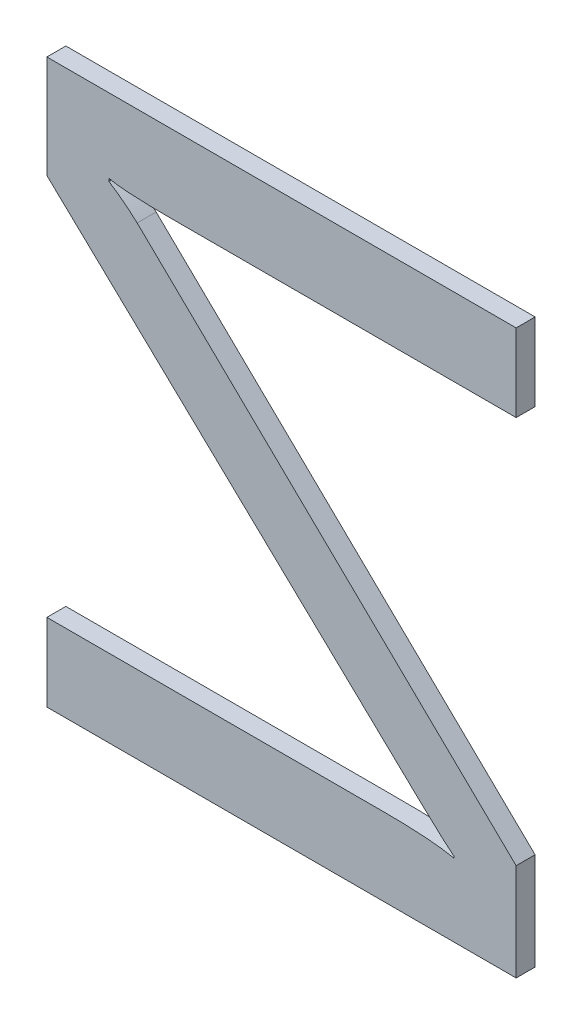
ISO-10303-21;
HEADER;
FILE_DESCRIPTION(('STEP AP214'),'2;1');
FILE_NAME('part.step','',(''),(''),'','','');
FILE_SCHEMA(('AUTOMOTIVE_DESIGN { 1 0 10303 214 1 1 1 1 }'));
ENDSEC;
DATA;
#1=APPLICATION_CONTEXT('core data for automotive mechanical design processes');
#2=APPLICATION_PROTOCOL_DEFINITION('international standard','automotive_design',2000,#1);
#3=PRODUCT_CONTEXT('',#1,'mechanical');
#4=PRODUCT('Part','Part','',(#3));
#5=PRODUCT_RELATED_PRODUCT_CATEGORY('part','',(#4));
#6=PRODUCT_DEFINITION_FORMATION('','',#4);
#7=PRODUCT_DEFINITION_CONTEXT('part definition',#1,'design');
#8=PRODUCT_DEFINITION('design','',#6,#7);
#9=PRODUCT_DEFINITION_SHAPE('','',#8);
#10=(LENGTH_UNIT() NAMED_UNIT(*) SI_UNIT(.MILLI.,.METRE.));
#11=(NAMED_UNIT(*) PLANE_ANGLE_UNIT() SI_UNIT($,.RADIAN.));
#12=(NAMED_UNIT(*) SI_UNIT($,.STERADIAN.) SOLID_ANGLE_UNIT());
#13=UNCERTAINTY_MEASURE_WITH_UNIT(LENGTH_MEASURE(1.E-05),#10,'distance_accuracy_value','');
#14=(GEOMETRIC_REPRESENTATION_CONTEXT(3) GLOBAL_UNCERTAINTY_ASSIGNED_CONTEXT((#13)) GLOBAL_UNIT_ASSIGNED_CONTEXT((#10,
#11,#12)) REPRESENTATION_CONTEXT('',''));
#15=CARTESIAN_POINT('',(0.,0.,0.));
#16=DIRECTION('',(0.,0.,1.));
#17=DIRECTION('',(1.,0.,0.));
#18=AXIS2_PLACEMENT_3D('',#15,#16,#17);
#19=CARTESIAN_POINT('',(-8.95983005625009,-22.770458436575,135.210489149433));
#20=DIRECTION('',(0.,0.,-1.));
#21=DIRECTION('',(0.,-1.,0.));
#22=AXIS2_PLACEMENT_3D('',#19,#20,#21);
#23=PLANE('',#22);
#24=CARTESIAN_POINT('',(-12.8508212671876,-42.050979159912,135.210489149433));
#25=CARTESIAN_POINT('',(-12.6975760748799,-42.0892903644555,135.210489149433));
#26=CARTESIAN_POINT('',(-12.3655443260348,-42.1084461070274,135.210489149433));
#27=CARTESIAN_POINT('',(-10.0413260748799,-42.1084461070274,135.210489149433));
#28=CARTESIAN_POINT('',(-8.22792463257218,-42.1084461070274,135.210489149433));
#29=CARTESIAN_POINT('',(-6.41452319026449,-42.1084461070274,135.210489149433));
#30=(BOUNDED_CURVE() B_SPLINE_CURVE(3,(#24,#25,#26,#27,#28,#29),.UNSPECIFIED.,.F.,
.F.) B_SPLINE_CURVE_WITH_KNOTS((4,2,4),(0.,0.219780052322297,1.),
.UNSPECIFIED.) CURVE() GEOMETRIC_REPRESENTATION_ITEM() RATIONAL_B_SPLINE_CURVE((1.,1.,1.,1.,1.,1.)) REPRESENTATION_ITEM(''));
#31=CARTESIAN_POINT('',(-12.8508212671876,-42.050979159912,135.210489149433));
#32=VERTEX_POINT('',#31);
#33=CARTESIAN_POINT('',(-6.41452319026449,-42.1084461070274,135.210489149433));
#34=VERTEX_POINT('',#33);
#35=EDGE_CURVE('E318',#32,#34,#30,.T.);
#36=ORIENTED_EDGE('',*,*,#35,.T.);
#37=DIRECTION('',(0.,1.,0.));
#38=VECTOR('',#37,1.);
#39=CARTESIAN_POINT('',(-6.41452319026449,5.40908312699247,135.210489149433));
#40=LINE('',#39,#38);
#41=CARTESIAN_POINT('',(-6.41452319026449,-40.8800901124361,135.210489149433));
#42=VERTEX_POINT('',#41);
#43=EDGE_CURVE('E62',#34,#42,#40,.T.);
#44=ORIENTED_EDGE('',*,*,#43,.T.);
#45=DIRECTION('',(-1.,0.,0.));
#46=VECTOR('',#45,1.);
#47=CARTESIAN_POINT('',(2.66453525910038E-13,-40.8800901124361,135.210489149433));
#48=LINE('',#47,#46);
#49=CARTESIAN_POINT('',(-13.8325482804087,-40.8800901124361,135.210489149433));
#50=VERTEX_POINT('',#49);
#51=EDGE_CURVE('E173',#42,#50,#48,.T.);
#52=ORIENTED_EDGE('',*,*,#51,.T.);
#53=DIRECTION('',(0.,-1.,0.));
#54=VECTOR('',#53,1.);
#55=CARTESIAN_POINT('',(-13.8325482804087,5.40908312699247,135.210489149433));
#56=LINE('',#55,#54);
#57=CARTESIAN_POINT('',(-13.8325482804087,-42.5035313684456,135.210489149433));
#58=VERTEX_POINT('',#57);
#59=EDGE_CURVE('E159',#50,#58,#56,.T.);
#60=ORIENTED_EDGE('',*,*,#59,.T.);
#61=DIRECTION('',(0.724151841395312,-0.689640566239965,0.));
#62=VECTOR('',#61,1.);
#63=CARTESIAN_POINT('',(-30.5065914345945,-26.6241316279084,135.210489149433));
#64=LINE('',#63,#62);
#65=CARTESIAN_POINT('',(-7.90387490300488,-48.1496589225322,135.210489149433));
#66=VERTEX_POINT('',#65);
#67=EDGE_CURVE('E237',#58,#66,#64,.T.);
#68=ORIENTED_EDGE('',*,*,#67,.T.);
#69=CARTESIAN_POINT('',(-7.90387490300488,-48.1496589225322,135.210489149433));
#70=CARTESIAN_POINT('',(-7.59738451838949,-48.4369936581091,135.210489149433));
#71=CARTESIAN_POINT('',(-7.42817653463893,-48.587844394287,135.210489149433));
#72=CARTESIAN_POINT('',(-7.39625020348565,-48.6022111310659,135.210489149433));
#73=(BOUNDED_CURVE() B_SPLINE_CURVE(3,(#69,#70,#71,#72),.UNSPECIFIED.,.F.,
.F.) B_SPLINE_CURVE_WITH_KNOTS((4,4),(0.,1.),
.UNSPECIFIED.) CURVE() GEOMETRIC_REPRESENTATION_ITEM() RATIONAL_B_SPLINE_CURVE((1.,1.,1.,1.)) REPRESENTATION_ITEM(''));
#74=CARTESIAN_POINT('',(-7.39625020348565,-48.6022111310659,135.210489149433));
#75=VERTEX_POINT('',#74);
#76=EDGE_CURVE('E53',#66,#75,#73,.T.);
#77=ORIENTED_EDGE('',*,*,#76,.T.);
#78=DIRECTION('',(0.,-1.,0.));
#79=VECTOR('',#78,1.);
#80=CARTESIAN_POINT('',(-7.39625020348565,5.40908312699247,135.210489149433));
#81=LINE('',#80,#79);
#82=CARTESIAN_POINT('',(-7.39625020348565,-48.6309446046236,135.210489149433));
#83=VERTEX_POINT('',#82);
#84=EDGE_CURVE('E210',#75,#83,#81,.T.);
#85=ORIENTED_EDGE('',*,*,#84,.T.);
#86=CARTESIAN_POINT('',(-7.39625020348565,-48.6309446046236,135.210489149433));
#87=CARTESIAN_POINT('',(-7.64208078339006,-48.5782663827009,135.210489149433));
#88=CARTESIAN_POINT('',(-8.01401988497603,-48.5519275523399,135.210489149433));
#89=CARTESIAN_POINT('',(-10.2855606001203,-48.5519275523399,135.210489149433));
#90=CARTESIAN_POINT('',(-12.0590544402645,-48.5519275523399,135.210489149433));
#91=CARTESIAN_POINT('',(-13.8325482804087,-48.5519275523399,135.210489149433));
#92=(BOUNDED_CURVE() B_SPLINE_CURVE(3,(#86,#87,#88,#89,#90,#91),.UNSPECIFIED.,.F.,
.F.) B_SPLINE_CURVE_WITH_KNOTS((4,2,4),(0.,0.21925509486999,1.),
.UNSPECIFIED.) CURVE() GEOMETRIC_REPRESENTATION_ITEM() RATIONAL_B_SPLINE_CURVE((1.,1.,1.,1.,1.,1.)) REPRESENTATION_ITEM(''));
#93=CARTESIAN_POINT('',(-13.8325482804087,-48.5519275523399,135.210489149433));
#94=VERTEX_POINT('',#93);
#95=EDGE_CURVE('E220',#83,#94,#92,.T.);
#96=ORIENTED_EDGE('',*,*,#95,.T.);
#97=DIRECTION('',(0.,-1.,0.));
#98=VECTOR('',#97,1.);
#99=CARTESIAN_POINT('',(-13.8325482804087,5.40908312699247,135.210489149433));
#100=LINE('',#99,#98);
#101=CARTESIAN_POINT('',(-13.8325482804087,-49.7802835469312,135.210489149433));
#102=VERTEX_POINT('',#101);
#103=EDGE_CURVE('E219',#94,#102,#100,.T.);
#104=ORIENTED_EDGE('',*,*,#103,.T.);
#105=DIRECTION('',(1.,0.,0.));
#106=VECTOR('',#105,1.);
#107=CARTESIAN_POINT('',(2.66453525910038E-13,-49.7802835469312,135.210489149433));
#108=LINE('',#107,#106);
#109=CARTESIAN_POINT('',(-6.41452319026449,-49.7802835469312,135.210489149433));
#110=VERTEX_POINT('',#109);
#111=EDGE_CURVE('E88',#102,#110,#108,.T.);
#112=ORIENTED_EDGE('',*,*,#111,.T.);
#113=DIRECTION('',(0.,1.,0.));
#114=VECTOR('',#113,1.);
#115=CARTESIAN_POINT('',(-6.41452319026449,5.40908312699247,135.210489149433));
#116=LINE('',#115,#114);
#117=CARTESIAN_POINT('',(-6.41452319026449,-48.2430427115947,135.210489149433));
#118=VERTEX_POINT('',#117);
#119=EDGE_CURVE('E47',#110,#118,#116,.T.);
#120=ORIENTED_EDGE('',*,*,#119,.T.);
#121=DIRECTION('',(-0.718213324339423,0.695822980894792,0.));
#122=VECTOR('',#121,1.);
#123=CARTESIAN_POINT('',(-29.9183315370501,-25.4719669991212,135.210489149433));
#124=LINE('',#123,#122);
#125=CARTESIAN_POINT('',(-12.4054524270433,-42.4388810529409,135.210489149433));
#126=VERTEX_POINT('',#125);
#127=EDGE_CURVE('E182',#118,#126,#124,.T.);
#128=ORIENTED_EDGE('',*,*,#127,.T.);
#129=CARTESIAN_POINT('',(-12.4054524270433,-42.4388810529409,135.210489149433));
#130=CARTESIAN_POINT('',(-12.6161641923327,-42.2449301064264,135.210489149433));
#131=CARTESIAN_POINT('',(-12.8508212671876,-42.0940793702485,135.210489149433));
#132=(BOUNDED_CURVE() B_SPLINE_CURVE(2,(#129,#130,#131),.UNSPECIFIED.,.F.,
.F.) B_SPLINE_CURVE_WITH_KNOTS((3,3),(0.,1.),
.UNSPECIFIED.) CURVE() GEOMETRIC_REPRESENTATION_ITEM() RATIONAL_B_SPLINE_CURVE((1.,1.,1.)) REPRESENTATION_ITEM(''));
#133=CARTESIAN_POINT('',(-12.8508212671876,-42.0940793702485,135.210489149433));
#134=VERTEX_POINT('',#133);
#135=EDGE_CURVE('E11',#126,#134,#132,.T.);
#136=ORIENTED_EDGE('',*,*,#135,.T.);
#137=DIRECTION('',(0.,1.,0.));
#138=VECTOR('',#137,1.);
#139=CARTESIAN_POINT('',(-12.8508212671876,5.40908312699247,135.210489149433));
#140=LINE('',#139,#138);
#141=EDGE_CURVE('E236',#134,#32,#140,.T.);
#142=ORIENTED_EDGE('',*,*,#141,.T.);
#143=EDGE_LOOP('',(#36,#44,#52,#60,#68,#77,#85,#96,#104,#112,#120,#128,#136,#142));
#144=FACE_BOUND('',#143,.T.);
#145=ADVANCED_FACE('F43',(#144),#23,.F.);
#146=CARTESIAN_POINT('',(-12.8508212671876,-42.0940793702485,135.410489149433));
#147=CARTESIAN_POINT('',(-12.6161641923327,-42.2449301064264,135.410489149433));
#148=CARTESIAN_POINT('',(-12.4054524270433,-42.4388810529409,135.410489149433));
#149=(BOUNDED_CURVE() B_SPLINE_CURVE(2,(#146,#147,#148),.UNSPECIFIED.,.F.,
.F.) B_SPLINE_CURVE_WITH_KNOTS((3,3),(0.,1.),
.UNSPECIFIED.) CURVE() GEOMETRIC_REPRESENTATION_ITEM() RATIONAL_B_SPLINE_CURVE((1.,1.,1.)) REPRESENTATION_ITEM(''));
#150=DIRECTION('',(0.,0.,-1.));
#151=VECTOR('',#150,1.);
#152=SURFACE_OF_LINEAR_EXTRUSION('',#149,#151);
#153=ORIENTED_EDGE('',*,*,#135,.F.);
#154=CARTESIAN_POINT('',(-12.4054524270433,-42.4388810529409,135.210489149433));
#155=CARTESIAN_POINT('',(-12.4054524270433,-42.4388810529409,134.910489149433));
#156=(BOUNDED_CURVE() B_SPLINE_CURVE(1,(#154,#155),.UNSPECIFIED.,.F.,
.F.) B_SPLINE_CURVE_WITH_KNOTS((2,2),(0.,1.),
.UNSPECIFIED.) CURVE() GEOMETRIC_REPRESENTATION_ITEM() RATIONAL_B_SPLINE_CURVE((1.,1.)) REPRESENTATION_ITEM(''));
#157=CARTESIAN_POINT('',(-12.4054524270433,-42.4388810529409,134.910489149433));
#158=VERTEX_POINT('',#157);
#159=EDGE_CURVE('E141',#126,#158,#156,.T.);
#160=ORIENTED_EDGE('',*,*,#159,.T.);
#161=CARTESIAN_POINT('',(-12.8508212671876,-42.0940793702486,134.910489149433));
#162=CARTESIAN_POINT('',(-12.6943832172843,-42.1946465277005,134.910489149433));
#163=CARTESIAN_POINT('',(-12.5459269372362,-42.3095804219312,134.910489149433));
#164=CARTESIAN_POINT('',(-12.4054524270433,-42.4388810529409,134.910489149433));
#165=(BOUNDED_CURVE() B_SPLINE_CURVE(3,(#161,#162,#163,#164),.UNSPECIFIED.,.F.,
.F.) B_SPLINE_CURVE_WITH_KNOTS((4,4),(0.,1.),
.UNSPECIFIED.) CURVE() GEOMETRIC_REPRESENTATION_ITEM() RATIONAL_B_SPLINE_CURVE((1.,1.,1.,1.)) REPRESENTATION_ITEM(''));
#166=CARTESIAN_POINT('',(-12.8508211005209,-42.0940792792566,134.910489149433));
#167=VERTEX_POINT('',#166);
#168=EDGE_CURVE('E281',#167,#158,#165,.T.);
#169=ORIENTED_EDGE('',*,*,#168,.F.);
#170=CARTESIAN_POINT('',(-12.8508212671876,-42.0940792792566,135.210489149433));
#171=CARTESIAN_POINT('',(-12.8508212671876,-42.0940792792566,135.110489149433));
#172=CARTESIAN_POINT('',(-12.8508212671876,-42.0940792792566,135.010489149433));
#173=CARTESIAN_POINT('',(-12.8508212671876,-42.0940792792566,134.910489149433));
#174=(BOUNDED_CURVE() B_SPLINE_CURVE(3,(#170,#171,#172,#173),.UNSPECIFIED.,.F.,
.F.) B_SPLINE_CURVE_WITH_KNOTS((4,4),(0.,1.),
.UNSPECIFIED.) CURVE() GEOMETRIC_REPRESENTATION_ITEM() RATIONAL_B_SPLINE_CURVE((1.,1.,1.,1.)) REPRESENTATION_ITEM(''));
#175=EDGE_CURVE('E149',#134,#167,#174,.T.);
#176=ORIENTED_EDGE('',*,*,#175,.F.);
#177=EDGE_LOOP('',(#153,#160,#169,#176));
#178=FACE_BOUND('',#177,.T.);
#179=ADVANCED_FACE('F438',(#178),#152,.T.);
#180=CARTESIAN_POINT('',(-7.90387490300488,-48.1496589225322,135.410489149433));
#181=CARTESIAN_POINT('',(-7.59738451838949,-48.4369936581091,135.410489149433));
#182=CARTESIAN_POINT('',(-7.42817653463893,-48.587844394287,135.410489149433));
#183=CARTESIAN_POINT('',(-7.39625020348565,-48.6022111310659,135.410489149433));
#184=(BOUNDED_CURVE() B_SPLINE_CURVE(3,(#180,#181,#182,#183),.UNSPECIFIED.,.F.,
.F.) B_SPLINE_CURVE_WITH_KNOTS((4,4),(0.,1.),
.UNSPECIFIED.) CURVE() GEOMETRIC_REPRESENTATION_ITEM() RATIONAL_B_SPLINE_CURVE((1.,1.,1.,1.)) REPRESENTATION_ITEM(''));
#185=DIRECTION('',(0.,0.,-1.));
#186=VECTOR('',#185,1.);
#187=SURFACE_OF_LINEAR_EXTRUSION('',#184,#186);
#188=ORIENTED_EDGE('',*,*,#76,.F.);
#189=CARTESIAN_POINT('',(-7.90387490300488,-48.1496589225322,135.210489149433));
#190=CARTESIAN_POINT('',(-7.90387490300488,-48.1496589225322,134.910489149433));
#191=(BOUNDED_CURVE() B_SPLINE_CURVE(1,(#189,#190),.UNSPECIFIED.,.F.,
.F.) B_SPLINE_CURVE_WITH_KNOTS((2,2),(0.,1.),
.UNSPECIFIED.) CURVE() GEOMETRIC_REPRESENTATION_ITEM() RATIONAL_B_SPLINE_CURVE((1.,1.)) REPRESENTATION_ITEM(''));
#192=CARTESIAN_POINT('',(-7.90387490300488,-48.1496589225322,134.910489149433));
#193=VERTEX_POINT('',#192);
#194=EDGE_CURVE('E232',#66,#193,#191,.T.);
#195=ORIENTED_EDGE('',*,*,#194,.T.);
#196=CARTESIAN_POINT('',(-7.39625020348565,-48.6022111310659,134.910489149433));
#197=CARTESIAN_POINT('',(-7.42817653463893,-48.587844394287,134.910489149433));
#198=CARTESIAN_POINT('',(-7.59738451838949,-48.4369936581091,134.910489149433));
#199=CARTESIAN_POINT('',(-7.90387490300488,-48.1496589225322,134.910489149433));
#200=(BOUNDED_CURVE() B_SPLINE_CURVE(3,(#196,#197,#198,#199),.UNSPECIFIED.,.F.,
.F.) B_SPLINE_CURVE_WITH_KNOTS((4,4),(0.,1.),
.UNSPECIFIED.) CURVE() GEOMETRIC_REPRESENTATION_ITEM() RATIONAL_B_SPLINE_CURVE((1.,1.,1.,1.)) REPRESENTATION_ITEM(''));
#201=CARTESIAN_POINT('',(-7.39625020348565,-48.6022111310659,134.910489149433));
#202=VERTEX_POINT('',#201);
#203=EDGE_CURVE('E290',#202,#193,#200,.T.);
#204=ORIENTED_EDGE('',*,*,#203,.F.);
#205=CARTESIAN_POINT('',(-7.39625020348565,-48.6022111310659,135.210489149433));
#206=CARTESIAN_POINT('',(-7.39625020348565,-48.6022111310659,135.110489149433));
#207=CARTESIAN_POINT('',(-7.39625020348565,-48.6022111310659,135.010489149433));
#208=CARTESIAN_POINT('',(-7.39625020348565,-48.6022111310659,134.910489149433));
#209=(BOUNDED_CURVE() B_SPLINE_CURVE(3,(#205,#206,#207,#208),.UNSPECIFIED.,.F.,
.F.) B_SPLINE_CURVE_WITH_KNOTS((4,4),(0.,1.),
.UNSPECIFIED.) CURVE() GEOMETRIC_REPRESENTATION_ITEM() RATIONAL_B_SPLINE_CURVE((1.,1.,1.,1.)) REPRESENTATION_ITEM(''));
#210=EDGE_CURVE('E331',#75,#202,#209,.T.);
#211=ORIENTED_EDGE('',*,*,#210,.F.);
#212=EDGE_LOOP('',(#188,#195,#204,#211));
#213=FACE_BOUND('',#212,.T.);
#214=ADVANCED_FACE('F440',(#213),#187,.F.);
#215=CARTESIAN_POINT('',(-6.41452319026449,-40.8800901124361,135.410489149433));
#216=DIRECTION('',(1.,0.,0.));
#217=DIRECTION('',(0.,1.,0.));
#218=AXIS2_PLACEMENT_3D('',#215,#216,#217);
#219=PLANE('',#218);
#220=ORIENTED_EDGE('',*,*,#43,.F.);
#221=CARTESIAN_POINT('',(-6.41452319026449,-42.1084461070274,135.210489149433));
#222=CARTESIAN_POINT('',(-6.41452319026449,-42.1084461070274,135.110489149433));
#223=CARTESIAN_POINT('',(-6.41452319026449,-42.1084461070274,135.010489149433));
#224=CARTESIAN_POINT('',(-6.41452319026449,-42.1084461070274,134.910489149433));
#225=(BOUNDED_CURVE() B_SPLINE_CURVE(3,(#221,#222,#223,#224),.UNSPECIFIED.,.F.,
.F.) B_SPLINE_CURVE_WITH_KNOTS((4,4),(0.,1.),
.UNSPECIFIED.) CURVE() GEOMETRIC_REPRESENTATION_ITEM() RATIONAL_B_SPLINE_CURVE((1.,1.,1.,1.)) REPRESENTATION_ITEM(''));
#226=CARTESIAN_POINT('',(-6.41452319026449,-42.1084461070274,134.910489149433));
#227=VERTEX_POINT('',#226);
#228=EDGE_CURVE('E322',#34,#227,#225,.T.);
#229=ORIENTED_EDGE('',*,*,#228,.T.);
#230=CARTESIAN_POINT('',(-6.41452319026449,-40.8800901124361,134.910489149433));
#231=CARTESIAN_POINT('',(-6.41452319026449,-41.2895421106331,134.910489149433));
#232=CARTESIAN_POINT('',(-6.41452319026449,-41.6989941088303,134.910489149433));
#233=CARTESIAN_POINT('',(-6.41452319026449,-42.1084461070274,134.910489149433));
#234=(BOUNDED_CURVE() B_SPLINE_CURVE(3,(#230,#231,#232,#233),.UNSPECIFIED.,.F.,
.F.) B_SPLINE_CURVE_WITH_KNOTS((4,4),(0.,1.),
.UNSPECIFIED.) CURVE() GEOMETRIC_REPRESENTATION_ITEM() RATIONAL_B_SPLINE_CURVE((1.,1.,1.,1.)) REPRESENTATION_ITEM(''));
#235=CARTESIAN_POINT('',(-6.41452319026449,-40.8800901124361,134.910489149433));
#236=VERTEX_POINT('',#235);
#237=EDGE_CURVE('E195',#236,#227,#234,.T.);
#238=ORIENTED_EDGE('',*,*,#237,.F.);
#239=CARTESIAN_POINT('',(-6.41452319026449,-40.8800901124361,135.210489149433));
#240=CARTESIAN_POINT('',(-6.41452319026449,-40.8800901124361,135.110489149433));
#241=CARTESIAN_POINT('',(-6.41452319026449,-40.8800901124361,135.010489149433));
#242=CARTESIAN_POINT('',(-6.41452319026449,-40.8800901124361,134.910489149433));
#243=(BOUNDED_CURVE() B_SPLINE_CURVE(3,(#239,#240,#241,#242),.UNSPECIFIED.,.F.,
.F.) B_SPLINE_CURVE_WITH_KNOTS((4,4),(0.,1.),
.UNSPECIFIED.) CURVE() GEOMETRIC_REPRESENTATION_ITEM() RATIONAL_B_SPLINE_CURVE((1.,1.,1.,1.)) REPRESENTATION_ITEM(''));
#244=EDGE_CURVE('E177',#42,#236,#243,.T.);
#245=ORIENTED_EDGE('',*,*,#244,.F.);
#246=EDGE_LOOP('',(#220,#229,#238,#245));
#247=FACE_BOUND('',#246,.T.);
#248=ADVANCED_FACE('F447',(#247),#219,.T.);
#249=CARTESIAN_POINT('',(-12.8508212671876,-42.050979159912,135.410489149433));
#250=CARTESIAN_POINT('',(-12.6975760748799,-42.0892903644555,135.410489149433));
#251=CARTESIAN_POINT('',(-12.3655443260348,-42.1084461070274,135.410489149433));
#252=CARTESIAN_POINT('',(-10.0413260748799,-42.1084461070274,135.410489149433));
#253=CARTESIAN_POINT('',(-8.22792463257218,-42.1084461070274,135.410489149433));
#254=CARTESIAN_POINT('',(-6.41452319026449,-42.1084461070274,135.410489149433));
#255=(BOUNDED_CURVE() B_SPLINE_CURVE(3,(#249,#250,#251,#252,#253,#254),.UNSPECIFIED.,.F.,
.F.) B_SPLINE_CURVE_WITH_KNOTS((4,2,4),(0.,0.219780052322297,1.),
.UNSPECIFIED.) CURVE() GEOMETRIC_REPRESENTATION_ITEM() RATIONAL_B_SPLINE_CURVE((1.,1.,1.,1.,1.,1.)) REPRESENTATION_ITEM(''));
#256=DIRECTION('',(0.,0.,-1.));
#257=VECTOR('',#256,1.);
#258=SURFACE_OF_LINEAR_EXTRUSION('',#255,#257);
#259=ORIENTED_EDGE('',*,*,#35,.F.);
#260=CARTESIAN_POINT('',(-12.8508212671876,-42.050979159912,135.210489149433));
#261=CARTESIAN_POINT('',(-12.8508212671876,-42.050979159912,134.910489149433));
#262=(BOUNDED_CURVE() B_SPLINE_CURVE(1,(#260,#261),.UNSPECIFIED.,.F.,
.F.) B_SPLINE_CURVE_WITH_KNOTS((2,2),(0.,1.),
.UNSPECIFIED.) CURVE() GEOMETRIC_REPRESENTATION_ITEM() RATIONAL_B_SPLINE_CURVE((1.,1.)) REPRESENTATION_ITEM(''));
#263=CARTESIAN_POINT('',(-12.8508212671876,-42.050979159912,134.910489149433));
#264=VERTEX_POINT('',#263);
#265=EDGE_CURVE('E260',#32,#264,#262,.T.);
#266=ORIENTED_EDGE('',*,*,#265,.T.);
#267=CARTESIAN_POINT('',(-6.41452319026449,-42.1084461070274,134.910489149433));
#268=CARTESIAN_POINT('',(-8.22792463257218,-42.1084461070274,134.910489149433));
#269=CARTESIAN_POINT('',(-10.0413260748799,-42.1084461070274,134.910489149433));
#270=CARTESIAN_POINT('',(-12.3655443260348,-42.1084461070274,134.910489149433));
#271=CARTESIAN_POINT('',(-12.6975760748799,-42.0892903644555,134.910489149433));
#272=CARTESIAN_POINT('',(-12.8508212671876,-42.050979159912,134.910489149433));
#273=(BOUNDED_CURVE() B_SPLINE_CURVE(3,(#267,#268,#269,#270,#271,#272),.UNSPECIFIED.,.F.,
.F.) B_SPLINE_CURVE_WITH_KNOTS((4,2,4),(0.,0.780219947677703,1.),
.UNSPECIFIED.) CURVE() GEOMETRIC_REPRESENTATION_ITEM() RATIONAL_B_SPLINE_CURVE((1.,1.,1.,1.,1.,1.)) REPRESENTATION_ITEM(''));
#274=EDGE_CURVE('E203',#227,#264,#273,.T.);
#275=ORIENTED_EDGE('',*,*,#274,.F.);
#276=ORIENTED_EDGE('',*,*,#228,.F.);
#277=EDGE_LOOP('',(#259,#266,#275,#276));
#278=FACE_BOUND('',#277,.T.);
#279=ADVANCED_FACE('F472',(#278),#258,.F.);
#280=CARTESIAN_POINT('',(-12.8508212671876,-42.050979159912,135.410489149433));
#281=DIRECTION('',(1.,0.,0.));
#282=DIRECTION('',(0.,1.,0.));
#283=AXIS2_PLACEMENT_3D('',#280,#281,#282);
#284=PLANE('',#283);
#285=ORIENTED_EDGE('',*,*,#141,.F.);
#286=ORIENTED_EDGE('',*,*,#175,.T.);
#287=CARTESIAN_POINT('',(-12.8508212671876,-42.050979159912,134.910489149433));
#288=CARTESIAN_POINT('',(-12.8508212671876,-42.0653458966909,134.910489149433));
#289=CARTESIAN_POINT('',(-12.8508212671876,-42.0797126334697,134.910489149433));
#290=CARTESIAN_POINT('',(-12.8508212671876,-42.0940793702485,134.910489149433));
#291=(BOUNDED_CURVE() B_SPLINE_CURVE(3,(#287,#288,#289,#290),.UNSPECIFIED.,.F.,
.F.) B_SPLINE_CURVE_WITH_KNOTS((4,4),(0.,1.),
.UNSPECIFIED.) CURVE() GEOMETRIC_REPRESENTATION_ITEM() RATIONAL_B_SPLINE_CURVE((1.,1.,1.,1.)) REPRESENTATION_ITEM(''));
#292=EDGE_CURVE('E247',#264,#167,#291,.T.);
#293=ORIENTED_EDGE('',*,*,#292,.F.);
#294=ORIENTED_EDGE('',*,*,#265,.F.);
#295=EDGE_LOOP('',(#285,#286,#293,#294));
#296=FACE_BOUND('',#295,.T.);
#297=ADVANCED_FACE('F436',(#296),#284,.T.);
#298=CARTESIAN_POINT('',(-7.90387490300488,-48.1496589225322,135.410489149433));
#299=DIRECTION('',(-0.689640566239965,-0.724151841395312,0.));
#300=DIRECTION('',(-0.724151841395312,0.689640566239965,0.));
#301=AXIS2_PLACEMENT_3D('',#298,#299,#300);
#302=PLANE('',#301);
#303=ORIENTED_EDGE('',*,*,#67,.F.);
#304=CARTESIAN_POINT('',(-13.8325482804087,-42.5035313684457,135.210489149433));
#305=CARTESIAN_POINT('',(-13.8325482804087,-42.5035313684457,135.110489149433));
#306=CARTESIAN_POINT('',(-13.8325482804087,-42.5035313684457,135.010489149433));
#307=CARTESIAN_POINT('',(-13.8325482804087,-42.5035313684457,134.910489149433));
#308=(BOUNDED_CURVE() B_SPLINE_CURVE(3,(#304,#305,#306,#307),.UNSPECIFIED.,.F.,
.F.) B_SPLINE_CURVE_WITH_KNOTS((4,4),(0.,1.),
.UNSPECIFIED.) CURVE() GEOMETRIC_REPRESENTATION_ITEM() RATIONAL_B_SPLINE_CURVE((1.,1.,1.,1.)) REPRESENTATION_ITEM(''));
#309=CARTESIAN_POINT('',(-13.8325482804087,-42.5035313684456,134.910489149433));
#310=VERTEX_POINT('',#309);
#311=EDGE_CURVE('E165',#58,#310,#308,.T.);
#312=ORIENTED_EDGE('',*,*,#311,.T.);
#313=CARTESIAN_POINT('',(-7.90387490300488,-48.1496589225322,134.910489149433));
#314=CARTESIAN_POINT('',(-9.88009936213949,-46.2676164045034,134.910489149433));
#315=CARTESIAN_POINT('',(-11.8563238212741,-44.3855738864745,134.910489149433));
#316=CARTESIAN_POINT('',(-13.8325482804087,-42.5035313684456,134.910489149433));
#317=(BOUNDED_CURVE() B_SPLINE_CURVE(3,(#313,#314,#315,#316),.UNSPECIFIED.,.F.,
.F.) B_SPLINE_CURVE_WITH_KNOTS((4,4),(0.,1.),
.UNSPECIFIED.) CURVE() GEOMETRIC_REPRESENTATION_ITEM() RATIONAL_B_SPLINE_CURVE((1.,1.,1.,1.)) REPRESENTATION_ITEM(''));
#318=EDGE_CURVE('E282',#193,#310,#317,.T.);
#319=ORIENTED_EDGE('',*,*,#318,.F.);
#320=ORIENTED_EDGE('',*,*,#194,.F.);
#321=EDGE_LOOP('',(#303,#312,#319,#320));
#322=FACE_BOUND('',#321,.T.);
#323=ADVANCED_FACE('F45',(#322),#302,.T.);
#324=CARTESIAN_POINT('',(-13.8325482804087,-42.5035313684456,135.410489149433));
#325=DIRECTION('',(-1.,0.,0.));
#326=DIRECTION('',(0.,0.,1.));
#327=AXIS2_PLACEMENT_3D('',#324,#325,#326);
#328=PLANE('',#327);
#329=ORIENTED_EDGE('',*,*,#59,.F.);
#330=CARTESIAN_POINT('',(-13.8325482804087,-40.880090112436,135.210489149433));
#331=CARTESIAN_POINT('',(-13.8325482804087,-40.880090112436,135.110489149433));
#332=CARTESIAN_POINT('',(-13.8325482804087,-40.880090112436,135.010489149433));
#333=CARTESIAN_POINT('',(-13.8325482804087,-40.880090112436,134.910489149433));
#334=(BOUNDED_CURVE() B_SPLINE_CURVE(3,(#330,#331,#332,#333),.UNSPECIFIED.,.F.,
.F.) B_SPLINE_CURVE_WITH_KNOTS((4,4),(0.,1.),
.UNSPECIFIED.) CURVE() GEOMETRIC_REPRESENTATION_ITEM() RATIONAL_B_SPLINE_CURVE((1.,1.,1.,1.)) REPRESENTATION_ITEM(''));
#335=CARTESIAN_POINT('',(-13.8325482804087,-40.8800901124361,134.910489149433));
#336=VERTEX_POINT('',#335);
#337=EDGE_CURVE('E163',#50,#336,#334,.T.);
#338=ORIENTED_EDGE('',*,*,#337,.T.);
#339=CARTESIAN_POINT('',(-13.8325482804087,-42.5035313684456,134.910489149433));
#340=CARTESIAN_POINT('',(-13.8325482804087,-41.9623842831091,134.910489149433));
#341=CARTESIAN_POINT('',(-13.8325482804087,-41.4212371977726,134.910489149433));
#342=CARTESIAN_POINT('',(-13.8325482804087,-40.8800901124361,134.910489149433));
#343=(BOUNDED_CURVE() B_SPLINE_CURVE(3,(#339,#340,#341,#342),.UNSPECIFIED.,.F.,
.F.) B_SPLINE_CURVE_WITH_KNOTS((4,4),(0.,1.),
.UNSPECIFIED.) CURVE() GEOMETRIC_REPRESENTATION_ITEM() RATIONAL_B_SPLINE_CURVE((1.,1.,1.,1.)) REPRESENTATION_ITEM(''));
#344=EDGE_CURVE('E211',#310,#336,#343,.T.);
#345=ORIENTED_EDGE('',*,*,#344,.F.);
#346=ORIENTED_EDGE('',*,*,#311,.F.);
#347=EDGE_LOOP('',(#329,#338,#345,#346));
#348=FACE_BOUND('',#347,.T.);
#349=ADVANCED_FACE('F161',(#348),#328,.T.);
#350=CARTESIAN_POINT('',(-13.8325482804087,-40.8800901124361,135.410489149433));
#351=DIRECTION('',(0.,1.,0.));
#352=DIRECTION('',(1.,0.,0.));
#353=AXIS2_PLACEMENT_3D('',#350,#351,#352);
#354=PLANE('',#353);
#355=ORIENTED_EDGE('',*,*,#51,.F.);
#356=ORIENTED_EDGE('',*,*,#244,.T.);
#357=CARTESIAN_POINT('',(-13.8325482804087,-40.8800901124361,134.910489149433));
#358=CARTESIAN_POINT('',(-11.3598732503606,-40.8800901124361,134.910489149433));
#359=CARTESIAN_POINT('',(-8.88719822031257,-40.8800901124361,134.910489149433));
#360=CARTESIAN_POINT('',(-6.41452319026449,-40.8800901124361,134.910489149433));
#361=(BOUNDED_CURVE() B_SPLINE_CURVE(3,(#357,#358,#359,#360),.UNSPECIFIED.,.F.,
.F.) B_SPLINE_CURVE_WITH_KNOTS((4,4),(0.,1.),
.UNSPECIFIED.) CURVE() GEOMETRIC_REPRESENTATION_ITEM() RATIONAL_B_SPLINE_CURVE((1.,1.,1.,1.)) REPRESENTATION_ITEM(''));
#362=EDGE_CURVE('E175',#336,#236,#361,.T.);
#363=ORIENTED_EDGE('',*,*,#362,.F.);
#364=ORIENTED_EDGE('',*,*,#337,.F.);
#365=EDGE_LOOP('',(#355,#356,#363,#364));
#366=FACE_BOUND('',#365,.T.);
#367=ADVANCED_FACE('F172',(#366),#354,.T.);
#368=CARTESIAN_POINT('',(-12.4054524270433,-42.4388810529409,135.410489149433));
#369=DIRECTION('',(0.695822980894792,0.718213324339423,0.));
#370=DIRECTION('',(0.,0.,-1.));
#371=AXIS2_PLACEMENT_3D('',#368,#369,#370);
#372=PLANE('',#371);
#373=ORIENTED_EDGE('',*,*,#127,.F.);
#374=CARTESIAN_POINT('',(-6.41452319026449,-48.2430427115947,135.210489149433));
#375=CARTESIAN_POINT('',(-6.41452319026449,-48.2430427115947,135.110489149433));
#376=CARTESIAN_POINT('',(-6.41452319026449,-48.2430427115947,135.010489149433));
#377=CARTESIAN_POINT('',(-6.41452319026449,-48.2430427115947,134.910489149433));
#378=(BOUNDED_CURVE() B_SPLINE_CURVE(3,(#374,#375,#376,#377),.UNSPECIFIED.,.F.,
.F.) B_SPLINE_CURVE_WITH_KNOTS((4,4),(0.,1.),
.UNSPECIFIED.) CURVE() GEOMETRIC_REPRESENTATION_ITEM() RATIONAL_B_SPLINE_CURVE((1.,1.,1.,1.)) REPRESENTATION_ITEM(''));
#379=CARTESIAN_POINT('',(-6.41452319026449,-48.2430427115947,134.910489149433));
#380=VERTEX_POINT('',#379);
#381=EDGE_CURVE('E328',#118,#380,#378,.T.);
#382=ORIENTED_EDGE('',*,*,#381,.T.);
#383=CARTESIAN_POINT('',(-12.4054524270433,-42.4388810529409,134.910489149433));
#384=CARTESIAN_POINT('',(-10.4084760147837,-44.3736016058254,134.910489149433));
#385=CARTESIAN_POINT('',(-8.41149960252411,-46.3083221587101,134.910489149433));
#386=CARTESIAN_POINT('',(-6.41452319026449,-48.2430427115947,134.910489149433));
#387=(BOUNDED_CURVE() B_SPLINE_CURVE(3,(#383,#384,#385,#386),.UNSPECIFIED.,.F.,
.F.) B_SPLINE_CURVE_WITH_KNOTS((4,4),(0.,1.),
.UNSPECIFIED.) CURVE() GEOMETRIC_REPRESENTATION_ITEM() RATIONAL_B_SPLINE_CURVE((1.,1.,1.,1.)) REPRESENTATION_ITEM(''));
#388=EDGE_CURVE('E272',#158,#380,#387,.T.);
#389=ORIENTED_EDGE('',*,*,#388,.F.);
#390=ORIENTED_EDGE('',*,*,#159,.F.);
#391=EDGE_LOOP('',(#373,#382,#389,#390));
#392=FACE_BOUND('',#391,.T.);
#393=ADVANCED_FACE('F481',(#392),#372,.T.);
#394=CARTESIAN_POINT('',(-6.41452319026449,-48.2430427115947,135.410489149433));
#395=DIRECTION('',(1.,0.,0.));
#396=DIRECTION('',(0.,1.,0.));
#397=AXIS2_PLACEMENT_3D('',#394,#395,#396);
#398=PLANE('',#397);
#399=ORIENTED_EDGE('',*,*,#119,.F.);
#400=CARTESIAN_POINT('',(-6.41452319026449,-49.7802835469313,135.210489149433));
#401=CARTESIAN_POINT('',(-6.41452319026449,-49.7802835469313,135.110489149433));
#402=CARTESIAN_POINT('',(-6.41452319026449,-49.7802835469313,135.010489149433));
#403=CARTESIAN_POINT('',(-6.41452319026449,-49.7802835469313,134.910489149433));
#404=(BOUNDED_CURVE() B_SPLINE_CURVE(3,(#400,#401,#402,#403),.UNSPECIFIED.,.F.,
.F.) B_SPLINE_CURVE_WITH_KNOTS((4,4),(0.,1.),
.UNSPECIFIED.) CURVE() GEOMETRIC_REPRESENTATION_ITEM() RATIONAL_B_SPLINE_CURVE((1.,1.,1.,1.)) REPRESENTATION_ITEM(''));
#405=CARTESIAN_POINT('',(-6.41452319026449,-49.7802835469312,134.910489149433));
#406=VERTEX_POINT('',#405);
#407=EDGE_CURVE('E307',#110,#406,#404,.T.);
#408=ORIENTED_EDGE('',*,*,#407,.T.);
#409=CARTESIAN_POINT('',(-6.41452319026449,-48.2430427115947,134.910489149433));
#410=CARTESIAN_POINT('',(-6.41452319026449,-48.7554563233736,134.910489149433));
#411=CARTESIAN_POINT('',(-6.41452319026449,-49.2678699351524,134.910489149433));
#412=CARTESIAN_POINT('',(-6.41452319026449,-49.7802835469312,134.910489149433));
#413=(BOUNDED_CURVE() B_SPLINE_CURVE(3,(#409,#410,#411,#412),.UNSPECIFIED.,.F.,
.F.) B_SPLINE_CURVE_WITH_KNOTS((4,4),(0.,1.),
.UNSPECIFIED.) CURVE() GEOMETRIC_REPRESENTATION_ITEM() RATIONAL_B_SPLINE_CURVE((1.,1.,1.,1.)) REPRESENTATION_ITEM(''));
#414=EDGE_CURVE('E280',#380,#406,#413,.T.);
#415=ORIENTED_EDGE('',*,*,#414,.F.);
#416=ORIENTED_EDGE('',*,*,#381,.F.);
#417=EDGE_LOOP('',(#399,#408,#415,#416));
#418=FACE_BOUND('',#417,.T.);
#419=ADVANCED_FACE('F477',(#418),#398,.T.);
#420=CARTESIAN_POINT('',(-6.41452319026449,-49.7802835469312,135.410489149433));
#421=DIRECTION('',(0.,-1.,0.));
#422=DIRECTION('',(0.,0.,-1.));
#423=AXIS2_PLACEMENT_3D('',#420,#421,#422);
#424=PLANE('',#423);
#425=ORIENTED_EDGE('',*,*,#111,.F.);
#426=CARTESIAN_POINT('',(-13.8325482804087,-49.7802835469312,135.210489149433));
#427=CARTESIAN_POINT('',(-13.8325482804087,-49.7802835469312,135.110489149433));
#428=CARTESIAN_POINT('',(-13.8325482804087,-49.7802835469312,135.010489149433));
#429=CARTESIAN_POINT('',(-13.8325482804087,-49.7802835469312,134.910489149433));
#430=(BOUNDED_CURVE() B_SPLINE_CURVE(3,(#426,#427,#428,#429),.UNSPECIFIED.,.F.,
.F.) B_SPLINE_CURVE_WITH_KNOTS((4,4),(0.,1.),
.UNSPECIFIED.) CURVE() GEOMETRIC_REPRESENTATION_ITEM() RATIONAL_B_SPLINE_CURVE((1.,1.,1.,1.)) REPRESENTATION_ITEM(''));
#431=CARTESIAN_POINT('',(-13.8325482804087,-49.7802835469312,134.910489149433));
#432=VERTEX_POINT('',#431);
#433=EDGE_CURVE('E225',#102,#432,#430,.T.);
#434=ORIENTED_EDGE('',*,*,#433,.T.);
#435=CARTESIAN_POINT('',(-6.41452319026449,-49.7802835469312,134.910489149433));
#436=CARTESIAN_POINT('',(-8.88719822031257,-49.7802835469312,134.910489149433));
#437=CARTESIAN_POINT('',(-11.3598732503606,-49.7802835469312,134.910489149433));
#438=CARTESIAN_POINT('',(-13.8325482804087,-49.7802835469312,134.910489149433));
#439=(BOUNDED_CURVE() B_SPLINE_CURVE(3,(#435,#436,#437,#438),.UNSPECIFIED.,.F.,
.F.) B_SPLINE_CURVE_WITH_KNOTS((4,4),(0.,1.),
.UNSPECIFIED.) CURVE() GEOMETRIC_REPRESENTATION_ITEM() RATIONAL_B_SPLINE_CURVE((1.,1.,1.,1.)) REPRESENTATION_ITEM(''));
#440=EDGE_CURVE('E186',#406,#432,#439,.T.);
#441=ORIENTED_EDGE('',*,*,#440,.F.);
#442=ORIENTED_EDGE('',*,*,#407,.F.);
#443=EDGE_LOOP('',(#425,#434,#441,#442));
#444=FACE_BOUND('',#443,.T.);
#445=ADVANCED_FACE('F480',(#444),#424,.T.);
#446=CARTESIAN_POINT('',(-13.8325482804087,-49.7802835469312,135.410489149433));
#447=DIRECTION('',(-1.,0.,0.));
#448=DIRECTION('',(0.,0.,1.));
#449=AXIS2_PLACEMENT_3D('',#446,#447,#448);
#450=PLANE('',#449);
#451=ORIENTED_EDGE('',*,*,#103,.F.);
#452=CARTESIAN_POINT('',(-13.8325482804087,-48.5519275523399,135.210489149433));
#453=CARTESIAN_POINT('',(-13.8325482804087,-48.5519275523399,135.110489149433));
#454=CARTESIAN_POINT('',(-13.8325482804087,-48.5519275523399,135.010489149433));
#455=CARTESIAN_POINT('',(-13.8325482804087,-48.5519275523399,134.910489149433));
#456=(BOUNDED_CURVE() B_SPLINE_CURVE(3,(#452,#453,#454,#455),.UNSPECIFIED.,.F.,
.F.) B_SPLINE_CURVE_WITH_KNOTS((4,4),(0.,1.),
.UNSPECIFIED.) CURVE() GEOMETRIC_REPRESENTATION_ITEM() RATIONAL_B_SPLINE_CURVE((1.,1.,1.,1.)) REPRESENTATION_ITEM(''));
#457=CARTESIAN_POINT('',(-13.8325482804087,-48.5519275523399,134.910489149433));
#458=VERTEX_POINT('',#457);
#459=EDGE_CURVE('E212',#94,#458,#456,.T.);
#460=ORIENTED_EDGE('',*,*,#459,.T.);
#461=CARTESIAN_POINT('',(-13.8325482804087,-49.7802835469312,134.910489149433));
#462=CARTESIAN_POINT('',(-13.8325482804087,-49.3708315487341,134.910489149433));
#463=CARTESIAN_POINT('',(-13.8325482804087,-48.961379550537,134.910489149433));
#464=CARTESIAN_POINT('',(-13.8325482804087,-48.5519275523399,134.910489149433));
#465=(BOUNDED_CURVE() B_SPLINE_CURVE(3,(#461,#462,#463,#464),.UNSPECIFIED.,.F.,
.F.) B_SPLINE_CURVE_WITH_KNOTS((4,4),(0.,1.),
.UNSPECIFIED.) CURVE() GEOMETRIC_REPRESENTATION_ITEM() RATIONAL_B_SPLINE_CURVE((1.,1.,1.,1.)) REPRESENTATION_ITEM(''));
#466=EDGE_CURVE('E189',#432,#458,#465,.T.);
#467=ORIENTED_EDGE('',*,*,#466,.F.);
#468=ORIENTED_EDGE('',*,*,#433,.F.);
#469=EDGE_LOOP('',(#451,#460,#467,#468));
#470=FACE_BOUND('',#469,.T.);
#471=ADVANCED_FACE('F381',(#470),#450,.T.);
#472=CARTESIAN_POINT('',(-7.39625020348565,-48.6309446046236,135.410489149433));
#473=CARTESIAN_POINT('',(-7.64208078339006,-48.5782663827009,135.410489149433));
#474=CARTESIAN_POINT('',(-8.01401988497603,-48.5519275523399,135.410489149433));
#475=CARTESIAN_POINT('',(-10.2855606001203,-48.5519275523399,135.410489149433));
#476=CARTESIAN_POINT('',(-12.0590544402645,-48.5519275523399,135.410489149433));
#477=CARTESIAN_POINT('',(-13.8325482804087,-48.5519275523399,135.410489149433));
#478=(BOUNDED_CURVE() B_SPLINE_CURVE(3,(#472,#473,#474,#475,#476,#477),.UNSPECIFIED.,.F.,
.F.) B_SPLINE_CURVE_WITH_KNOTS((4,2,4),(0.,0.21925509486999,1.),
.UNSPECIFIED.) CURVE() GEOMETRIC_REPRESENTATION_ITEM() RATIONAL_B_SPLINE_CURVE((1.,1.,1.,1.,1.,1.)) REPRESENTATION_ITEM(''));
#479=DIRECTION('',(0.,0.,-1.));
#480=VECTOR('',#479,1.);
#481=SURFACE_OF_LINEAR_EXTRUSION('',#478,#480);
#482=ORIENTED_EDGE('',*,*,#95,.F.);
#483=CARTESIAN_POINT('',(-7.39625020348565,-48.6309446046236,135.210489149433));
#484=CARTESIAN_POINT('',(-7.39625020348565,-48.6309446046236,134.910489149433));
#485=(BOUNDED_CURVE() B_SPLINE_CURVE(1,(#483,#484),.UNSPECIFIED.,.F.,
.F.) B_SPLINE_CURVE_WITH_KNOTS((2,2),(0.,1.),
.UNSPECIFIED.) CURVE() GEOMETRIC_REPRESENTATION_ITEM() RATIONAL_B_SPLINE_CURVE((1.,1.)) REPRESENTATION_ITEM(''));
#486=CARTESIAN_POINT('',(-7.39625020348565,-48.6309446046236,134.910489149433));
#487=VERTEX_POINT('',#486);
#488=EDGE_CURVE('E298',#83,#487,#485,.T.);
#489=ORIENTED_EDGE('',*,*,#488,.T.);
#490=CARTESIAN_POINT('',(-13.8325482804087,-48.5519275523399,134.910489149433));
#491=CARTESIAN_POINT('',(-12.0590544402645,-48.5519275523399,134.910489149433));
#492=CARTESIAN_POINT('',(-10.2855606001203,-48.5519275523399,134.910489149433));
#493=CARTESIAN_POINT('',(-8.01401988497603,-48.5519275523399,134.910489149433));
#494=CARTESIAN_POINT('',(-7.64208078339006,-48.5782663827009,134.910489149433));
#495=CARTESIAN_POINT('',(-7.39625020348565,-48.6309446046236,134.910489149433));
#496=(BOUNDED_CURVE() B_SPLINE_CURVE(3,(#490,#491,#492,#493,#494,#495),.UNSPECIFIED.,.F.,
.F.) B_SPLINE_CURVE_WITH_KNOTS((4,2,4),(0.,0.78074490513001,1.),
.UNSPECIFIED.) CURVE() GEOMETRIC_REPRESENTATION_ITEM() RATIONAL_B_SPLINE_CURVE((1.,1.,1.,1.,1.,1.)) REPRESENTATION_ITEM(''));
#497=EDGE_CURVE('E194',#458,#487,#496,.T.);
#498=ORIENTED_EDGE('',*,*,#497,.F.);
#499=ORIENTED_EDGE('',*,*,#459,.F.);
#500=EDGE_LOOP('',(#482,#489,#498,#499));
#501=FACE_BOUND('',#500,.T.);
#502=ADVANCED_FACE('F377',(#501),#481,.F.);
#503=CARTESIAN_POINT('',(-7.39625020348565,-48.6309446046236,135.410489149433));
#504=DIRECTION('',(-1.,0.,0.));
#505=DIRECTION('',(0.,0.,1.));
#506=AXIS2_PLACEMENT_3D('',#503,#504,#505);
#507=PLANE('',#506);
#508=ORIENTED_EDGE('',*,*,#84,.F.);
#509=ORIENTED_EDGE('',*,*,#210,.T.);
#510=CARTESIAN_POINT('',(-7.39625020348565,-48.6309446046236,134.910489149433));
#511=CARTESIAN_POINT('',(-7.39625020348565,-48.6213667801043,134.910489149433));
#512=CARTESIAN_POINT('',(-7.39625020348565,-48.6117889555851,134.910489149433));
#513=CARTESIAN_POINT('',(-7.39625020348565,-48.6022111310659,134.910489149433));
#514=(BOUNDED_CURVE() B_SPLINE_CURVE(3,(#510,#511,#512,#513),.UNSPECIFIED.,.F.,
.F.) B_SPLINE_CURVE_WITH_KNOTS((4,4),(0.,1.),
.UNSPECIFIED.) CURVE() GEOMETRIC_REPRESENTATION_ITEM() RATIONAL_B_SPLINE_CURVE((1.,1.,1.,1.)) REPRESENTATION_ITEM(''));
#515=EDGE_CURVE('E299',#487,#202,#514,.T.);
#516=ORIENTED_EDGE('',*,*,#515,.F.);
#517=ORIENTED_EDGE('',*,*,#488,.F.);
#518=EDGE_LOOP('',(#508,#509,#516,#517));
#519=FACE_BOUND('',#518,.T.);
#520=ADVANCED_FACE('F371',(#519),#507,.T.);
#521=CARTESIAN_POINT('',(-9.90085056699695,-42.1084461070274,134.910489149433));
#522=DIRECTION('',(0.,0.,1.));
#523=DIRECTION('',(1.,0.,0.));
#524=AXIS2_PLACEMENT_3D('',#521,#522,#523);
#525=PLANE('',#524);
#526=ORIENTED_EDGE('',*,*,#237,.T.);
#527=ORIENTED_EDGE('',*,*,#274,.T.);
#528=ORIENTED_EDGE('',*,*,#292,.T.);
#529=ORIENTED_EDGE('',*,*,#168,.T.);
#530=ORIENTED_EDGE('',*,*,#388,.T.);
#531=ORIENTED_EDGE('',*,*,#414,.T.);
#532=ORIENTED_EDGE('',*,*,#440,.T.);
#533=ORIENTED_EDGE('',*,*,#466,.T.);
#534=ORIENTED_EDGE('',*,*,#497,.T.);
#535=ORIENTED_EDGE('',*,*,#515,.T.);
#536=ORIENTED_EDGE('',*,*,#203,.T.);
#537=ORIENTED_EDGE('',*,*,#318,.T.);
#538=ORIENTED_EDGE('',*,*,#344,.T.);
#539=ORIENTED_EDGE('',*,*,#362,.T.);
#540=EDGE_LOOP('',(#526,#527,#528,#529,#530,#531,#532,#533,#534,#535,#536,#537,#538,#539));
#541=FACE_BOUND('',#540,.T.);
#542=ADVANCED_FACE('F433',(#541),#525,.F.);
#543=CLOSED_SHELL('',(#145,#179,#214,#248,#279,#297,#323,#349,#367,#393,#419,#445,#471,#502,
#520,#542));
#544=MANIFOLD_SOLID_BREP('B2',#543);
#545=ADVANCED_BREP_SHAPE_REPRESENTATION('',(#18,#544),#14);
#546=SHAPE_DEFINITION_REPRESENTATION(#9,#545);
ENDSEC;
END-ISO-10303-21;
